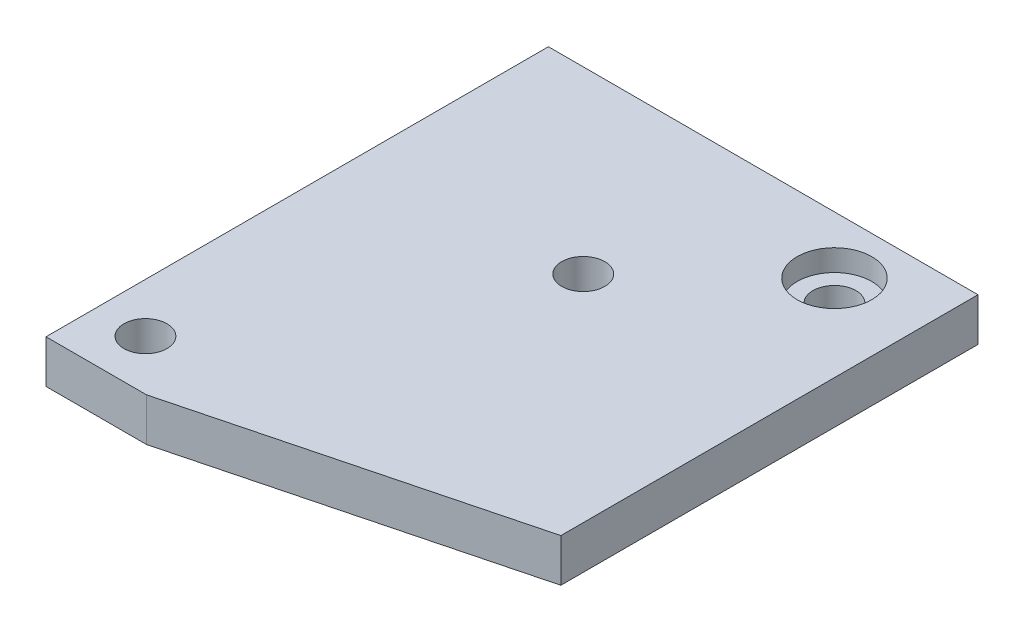
ISO-10303-21;
HEADER;
FILE_DESCRIPTION(('STEP AP214'),'2;1');
FILE_NAME('part.step','',(''),(''),'','','');
FILE_SCHEMA(('AUTOMOTIVE_DESIGN { 1 0 10303 214 1 1 1 1 }'));
ENDSEC;
DATA;
#1=APPLICATION_CONTEXT('core data for automotive mechanical design processes');
#2=APPLICATION_PROTOCOL_DEFINITION('international standard','automotive_design',2000,#1);
#3=PRODUCT_CONTEXT('',#1,'mechanical');
#4=PRODUCT('Part','Part','',(#3));
#5=PRODUCT_RELATED_PRODUCT_CATEGORY('part','',(#4));
#6=PRODUCT_DEFINITION_FORMATION('','',#4);
#7=PRODUCT_DEFINITION_CONTEXT('part definition',#1,'design');
#8=PRODUCT_DEFINITION('design','',#6,#7);
#9=PRODUCT_DEFINITION_SHAPE('','',#8);
#10=(LENGTH_UNIT() NAMED_UNIT(*) SI_UNIT(.MILLI.,.METRE.));
#11=(NAMED_UNIT(*) PLANE_ANGLE_UNIT() SI_UNIT($,.RADIAN.));
#12=(NAMED_UNIT(*) SI_UNIT($,.STERADIAN.) SOLID_ANGLE_UNIT());
#13=UNCERTAINTY_MEASURE_WITH_UNIT(LENGTH_MEASURE(1.E-05),#10,'distance_accuracy_value','');
#14=(GEOMETRIC_REPRESENTATION_CONTEXT(3) GLOBAL_UNCERTAINTY_ASSIGNED_CONTEXT((#13)) GLOBAL_UNIT_ASSIGNED_CONTEXT((#10,
#11,#12)) REPRESENTATION_CONTEXT('',''));
#15=CARTESIAN_POINT('',(0.,0.,0.));
#16=DIRECTION('',(0.,0.,1.));
#17=DIRECTION('',(1.,0.,0.));
#18=AXIS2_PLACEMENT_3D('',#15,#16,#17);
#19=CARTESIAN_POINT('',(-14.9273142149174,-3.,17.5));
#20=DIRECTION('',(0.,1.,0.));
#21=DIRECTION('',(0.,0.,1.));
#22=AXIS2_PLACEMENT_3D('',#19,#20,#21);
#23=PLANE('',#22);
#24=CARTESIAN_POINT('',(0.,-3.,-14.));
#25=DIRECTION('',(0.,-1.,0.));
#26=DIRECTION('',(1.,0.,0.));
#27=AXIS2_PLACEMENT_3D('',#24,#25,#26);
#28=CIRCLE('',#27,0.399766411699347);
#29=CARTESIAN_POINT('',(0.399766411699347,-3.,-14.));
#30=VERTEX_POINT('',#29);
#31=EDGE_CURVE('E206',#30,#30,#28,.T.);
#32=ORIENTED_EDGE('',*,*,#31,.F.);
#33=EDGE_LOOP('',(#32));
#34=FACE_BOUND('',#33,.T.);
#35=CARTESIAN_POINT('',(0.,-3.,-5.));
#36=DIRECTION('',(0.,1.,0.));
#37=DIRECTION('',(0.,0.,1.));
#38=AXIS2_PLACEMENT_3D('',#35,#36,#37);
#39=CIRCLE('',#38,1.5);
#40=CARTESIAN_POINT('',(0.,-3.,-3.5));
#41=VERTEX_POINT('',#40);
#42=EDGE_CURVE('E214',#41,#41,#39,.T.);
#43=ORIENTED_EDGE('',*,*,#42,.T.);
#44=EDGE_LOOP('',(#43));
#45=FACE_BOUND('',#44,.T.);
#46=CARTESIAN_POINT('',(-11.5,-3.,14.));
#47=DIRECTION('',(0.,1.,0.));
#48=DIRECTION('',(0.,0.,1.));
#49=AXIS2_PLACEMENT_3D('',#46,#47,#48);
#50=CIRCLE('',#49,1.5);
#51=CARTESIAN_POINT('',(-11.5,-3.,15.5));
#52=VERTEX_POINT('',#51);
#53=EDGE_CURVE('E185',#52,#52,#50,.T.);
#54=ORIENTED_EDGE('',*,*,#53,.T.);
#55=EDGE_LOOP('',(#54));
#56=FACE_BOUND('',#55,.T.);
#57=CARTESIAN_POINT('',(9.,-3.,-13.5));
#58=DIRECTION('',(0.,1.,0.));
#59=DIRECTION('',(0.,0.,1.));
#60=AXIS2_PLACEMENT_3D('',#57,#58,#59);
#61=CIRCLE('',#60,1.50000000000001);
#62=CARTESIAN_POINT('',(9.,-3.,-12.));
#63=VERTEX_POINT('',#62);
#64=EDGE_CURVE('E127',#63,#63,#61,.T.);
#65=ORIENTED_EDGE('',*,*,#64,.T.);
#66=EDGE_LOOP('',(#65));
#67=FACE_BOUND('',#66,.T.);
#68=DIRECTION('',(0.,0.,1.));
#69=VECTOR('',#68,1.);
#70=CARTESIAN_POINT('',(-14.9273142149174,-3.,-17.5));
#71=LINE('',#70,#69);
#72=CARTESIAN_POINT('',(-14.9273142149174,-3.,-17.5));
#73=VERTEX_POINT('',#72);
#74=CARTESIAN_POINT('',(-14.9273142149174,-3.,17.5));
#75=VERTEX_POINT('',#74);
#76=EDGE_CURVE('E116',#73,#75,#71,.T.);
#77=ORIENTED_EDGE('',*,*,#76,.F.);
#78=DIRECTION('',(-1.,0.,0.));
#79=VECTOR('',#78,1.);
#80=CARTESIAN_POINT('',(-14.9273142149174,-3.,-17.5));
#81=LINE('',#80,#79);
#82=CARTESIAN_POINT('',(15.,-3.,-17.5));
#83=VERTEX_POINT('',#82);
#84=EDGE_CURVE('E106',#83,#73,#81,.T.);
#85=ORIENTED_EDGE('',*,*,#84,.F.);
#86=DIRECTION('',(0.,0.,-1.));
#87=VECTOR('',#86,1.);
#88=CARTESIAN_POINT('',(15.,-3.,-17.5));
#89=LINE('',#88,#87);
#90=CARTESIAN_POINT('',(15.,-3.,11.5602508581691));
#91=VERTEX_POINT('',#90);
#92=EDGE_CURVE('E92',#91,#83,#89,.T.);
#93=ORIENTED_EDGE('',*,*,#92,.F.);
#94=DIRECTION('',(0.968041699521287,0.,-0.250789290018408));
#95=VECTOR('',#94,1.);
#96=CARTESIAN_POINT('',(15.,-3.,11.5602508581691));
#97=LINE('',#96,#95);
#98=CARTESIAN_POINT('',(-7.92731421491738,-3.,17.5));
#99=VERTEX_POINT('',#98);
#100=EDGE_CURVE('E105',#99,#91,#97,.T.);
#101=ORIENTED_EDGE('',*,*,#100,.F.);
#102=DIRECTION('',(1.,0.,0.));
#103=VECTOR('',#102,1.);
#104=CARTESIAN_POINT('',(-14.9273142149174,-3.,17.5));
#105=LINE('',#104,#103);
#106=EDGE_CURVE('E111',#75,#99,#105,.T.);
#107=ORIENTED_EDGE('',*,*,#106,.F.);
#108=EDGE_LOOP('',(#77,#85,#93,#101,#107));
#109=FACE_BOUND('',#108,.T.);
#110=CARTESIAN_POINT('',(0.,-3.,10.));
#111=DIRECTION('',(0.,-1.,0.));
#112=DIRECTION('',(0.,0.,-1.));
#113=AXIS2_PLACEMENT_3D('',#110,#111,#112);
#114=CIRCLE('',#113,0.39659374147233);
#115=CARTESIAN_POINT('',(0.,-3.,9.60340625852767));
#116=VERTEX_POINT('',#115);
#117=EDGE_CURVE('E204',#116,#116,#114,.T.);
#118=ORIENTED_EDGE('',*,*,#117,.F.);
#119=EDGE_LOOP('',(#118));
#120=FACE_BOUND('',#119,.T.);
#121=ADVANCED_FACE('F36',(#34,#45,#56,#67,#109,#120),#23,.F.);
#122=CARTESIAN_POINT('',(-14.9273142149174,-3.,-17.5));
#123=DIRECTION('',(-1.,0.,0.));
#124=DIRECTION('',(0.,0.,1.));
#125=AXIS2_PLACEMENT_3D('',#122,#123,#124);
#126=PLANE('',#125);
#127=DIRECTION('',(0.,0.,1.));
#128=VECTOR('',#127,1.);
#129=CARTESIAN_POINT('',(-14.9273142149174,0.,-17.5));
#130=LINE('',#129,#128);
#131=CARTESIAN_POINT('',(-14.9273142149174,0.,-17.5));
#132=VERTEX_POINT('',#131);
#133=CARTESIAN_POINT('',(-14.9273142149174,0.,17.5));
#134=VERTEX_POINT('',#133);
#135=EDGE_CURVE('E122',#132,#134,#130,.T.);
#136=ORIENTED_EDGE('',*,*,#135,.F.);
#137=DIRECTION('',(0.,1.,0.));
#138=VECTOR('',#137,1.);
#139=CARTESIAN_POINT('',(-14.9273142149174,-3.,-17.5));
#140=LINE('',#139,#138);
#141=EDGE_CURVE('E11',#73,#132,#140,.T.);
#142=ORIENTED_EDGE('',*,*,#141,.F.);
#143=ORIENTED_EDGE('',*,*,#76,.T.);
#144=DIRECTION('',(0.,1.,0.));
#145=VECTOR('',#144,1.);
#146=CARTESIAN_POINT('',(-14.9273142149174,-3.,17.5));
#147=LINE('',#146,#145);
#148=EDGE_CURVE('E40',#75,#134,#147,.T.);
#149=ORIENTED_EDGE('',*,*,#148,.T.);
#150=EDGE_LOOP('',(#136,#142,#143,#149));
#151=FACE_BOUND('',#150,.T.);
#152=ADVANCED_FACE('F38',(#151),#126,.T.);
#153=CARTESIAN_POINT('',(-14.9273142149174,-3.,-17.5));
#154=DIRECTION('',(0.,0.,-1.));
#155=DIRECTION('',(-1.,0.,0.));
#156=AXIS2_PLACEMENT_3D('',#153,#154,#155);
#157=PLANE('',#156);
#158=DIRECTION('',(-1.,0.,0.));
#159=VECTOR('',#158,1.);
#160=CARTESIAN_POINT('',(-14.9273142149174,0.,-17.5));
#161=LINE('',#160,#159);
#162=CARTESIAN_POINT('',(15.,0.,-17.5));
#163=VERTEX_POINT('',#162);
#164=EDGE_CURVE('E135',#163,#132,#161,.T.);
#165=ORIENTED_EDGE('',*,*,#164,.F.);
#166=DIRECTION('',(0.,1.,0.));
#167=VECTOR('',#166,1.);
#168=CARTESIAN_POINT('',(15.,-3.,-17.5));
#169=LINE('',#168,#167);
#170=EDGE_CURVE('E47',#83,#163,#169,.T.);
#171=ORIENTED_EDGE('',*,*,#170,.F.);
#172=ORIENTED_EDGE('',*,*,#84,.T.);
#173=ORIENTED_EDGE('',*,*,#141,.T.);
#174=EDGE_LOOP('',(#165,#171,#172,#173));
#175=FACE_BOUND('',#174,.T.);
#176=ADVANCED_FACE('F144',(#175),#157,.T.);
#177=CARTESIAN_POINT('',(15.,-3.,-17.5));
#178=DIRECTION('',(1.,0.,0.));
#179=DIRECTION('',(0.,0.,-1.));
#180=AXIS2_PLACEMENT_3D('',#177,#178,#179);
#181=PLANE('',#180);
#182=DIRECTION('',(0.,0.,-1.));
#183=VECTOR('',#182,1.);
#184=CARTESIAN_POINT('',(15.,0.,-17.5));
#185=LINE('',#184,#183);
#186=CARTESIAN_POINT('',(15.,0.,11.5602508581691));
#187=VERTEX_POINT('',#186);
#188=EDGE_CURVE('E94',#187,#163,#185,.T.);
#189=ORIENTED_EDGE('',*,*,#188,.F.);
#190=DIRECTION('',(0.,1.,0.));
#191=VECTOR('',#190,1.);
#192=CARTESIAN_POINT('',(15.,-3.,11.5602508581691));
#193=LINE('',#192,#191);
#194=EDGE_CURVE('E89',#91,#187,#193,.T.);
#195=ORIENTED_EDGE('',*,*,#194,.F.);
#196=ORIENTED_EDGE('',*,*,#92,.T.);
#197=ORIENTED_EDGE('',*,*,#170,.T.);
#198=EDGE_LOOP('',(#189,#195,#196,#197));
#199=FACE_BOUND('',#198,.T.);
#200=ADVANCED_FACE('F91',(#199),#181,.T.);
#201=CARTESIAN_POINT('',(15.,-3.,11.5602508581691));
#202=DIRECTION('',(0.250789290018408,0.,0.968041699521287));
#203=DIRECTION('',(0.968041699521288,0.,-0.250789290018409));
#204=AXIS2_PLACEMENT_3D('',#201,#202,#203);
#205=PLANE('',#204);
#206=DIRECTION('',(0.968041699521287,0.,-0.250789290018408));
#207=VECTOR('',#206,1.);
#208=CARTESIAN_POINT('',(15.,0.,11.5602508581691));
#209=LINE('',#208,#207);
#210=CARTESIAN_POINT('',(-7.92731421491738,0.,17.5));
#211=VERTEX_POINT('',#210);
#212=EDGE_CURVE('E131',#211,#187,#209,.T.);
#213=ORIENTED_EDGE('',*,*,#212,.F.);
#214=DIRECTION('',(0.,1.,0.));
#215=VECTOR('',#214,1.);
#216=CARTESIAN_POINT('',(-7.92731421491738,-3.,17.5));
#217=LINE('',#216,#215);
#218=EDGE_CURVE('E100',#99,#211,#217,.T.);
#219=ORIENTED_EDGE('',*,*,#218,.F.);
#220=ORIENTED_EDGE('',*,*,#100,.T.);
#221=ORIENTED_EDGE('',*,*,#194,.T.);
#222=EDGE_LOOP('',(#213,#219,#220,#221));
#223=FACE_BOUND('',#222,.T.);
#224=ADVANCED_FACE('F109',(#223),#205,.T.);
#225=CARTESIAN_POINT('',(-14.9273142149174,-3.,17.5));
#226=DIRECTION('',(0.,0.,1.));
#227=DIRECTION('',(1.,0.,0.));
#228=AXIS2_PLACEMENT_3D('',#225,#226,#227);
#229=PLANE('',#228);
#230=DIRECTION('',(1.,0.,0.));
#231=VECTOR('',#230,1.);
#232=CARTESIAN_POINT('',(-14.9273142149174,0.,17.5));
#233=LINE('',#232,#231);
#234=EDGE_CURVE('E126',#134,#211,#233,.T.);
#235=ORIENTED_EDGE('',*,*,#234,.F.);
#236=ORIENTED_EDGE('',*,*,#148,.F.);
#237=ORIENTED_EDGE('',*,*,#106,.T.);
#238=ORIENTED_EDGE('',*,*,#218,.T.);
#239=EDGE_LOOP('',(#235,#236,#237,#238));
#240=FACE_BOUND('',#239,.T.);
#241=ADVANCED_FACE('F141',(#240),#229,.T.);
#242=CARTESIAN_POINT('',(-14.9273142149174,0.,17.5));
#243=DIRECTION('',(0.,1.,0.));
#244=DIRECTION('',(0.,0.,1.));
#245=AXIS2_PLACEMENT_3D('',#242,#243,#244);
#246=PLANE('',#245);
#247=CARTESIAN_POINT('',(0.,0.,-5.));
#248=DIRECTION('',(0.,1.,0.));
#249=DIRECTION('',(0.,0.,1.));
#250=AXIS2_PLACEMENT_3D('',#247,#248,#249);
#251=CIRCLE('',#250,1.5);
#252=CARTESIAN_POINT('',(0.,0.,-3.5));
#253=VERTEX_POINT('',#252);
#254=EDGE_CURVE('E174',#253,#253,#251,.T.);
#255=ORIENTED_EDGE('',*,*,#254,.F.);
#256=EDGE_LOOP('',(#255));
#257=FACE_BOUND('',#256,.T.);
#258=CARTESIAN_POINT('',(-11.5,0.,14.));
#259=DIRECTION('',(0.,1.,0.));
#260=DIRECTION('',(0.,0.,1.));
#261=AXIS2_PLACEMENT_3D('',#258,#259,#260);
#262=CIRCLE('',#261,1.5);
#263=CARTESIAN_POINT('',(-11.5,0.,15.5));
#264=VERTEX_POINT('',#263);
#265=EDGE_CURVE('E178',#264,#264,#262,.T.);
#266=ORIENTED_EDGE('',*,*,#265,.F.);
#267=EDGE_LOOP('',(#266));
#268=FACE_BOUND('',#267,.T.);
#269=CARTESIAN_POINT('',(9.,0.,-13.5));
#270=DIRECTION('',(0.,1.,0.));
#271=DIRECTION('',(0.,0.,1.));
#272=AXIS2_PLACEMENT_3D('',#269,#270,#271);
#273=CIRCLE('',#272,2.60000000000001);
#274=CARTESIAN_POINT('',(9.,0.,-10.9));
#275=VERTEX_POINT('',#274);
#276=EDGE_CURVE('E181',#275,#275,#273,.T.);
#277=ORIENTED_EDGE('',*,*,#276,.F.);
#278=EDGE_LOOP('',(#277));
#279=FACE_BOUND('',#278,.T.);
#280=ORIENTED_EDGE('',*,*,#135,.T.);
#281=ORIENTED_EDGE('',*,*,#234,.T.);
#282=ORIENTED_EDGE('',*,*,#212,.T.);
#283=ORIENTED_EDGE('',*,*,#188,.T.);
#284=ORIENTED_EDGE('',*,*,#164,.T.);
#285=EDGE_LOOP('',(#280,#281,#282,#283,#284));
#286=FACE_BOUND('',#285,.T.);
#287=ADVANCED_FACE('F143',(#257,#268,#279,#286),#246,.T.);
#288=CARTESIAN_POINT('',(9.,0.,-13.5));
#289=DIRECTION('',(0.,1.,0.));
#290=DIRECTION('',(0.,0.,1.));
#291=AXIS2_PLACEMENT_3D('',#288,#289,#290);
#292=CYLINDRICAL_SURFACE('',#291,1.50000000000001);
#293=ORIENTED_EDGE('',*,*,#64,.F.);
#294=EDGE_LOOP('',(#293));
#295=FACE_BOUND('',#294,.T.);
#296=CARTESIAN_POINT('',(9.,-1.5,-13.5));
#297=DIRECTION('',(0.,1.,0.));
#298=DIRECTION('',(0.,0.,1.));
#299=AXIS2_PLACEMENT_3D('',#296,#297,#298);
#300=CIRCLE('',#299,1.50000000000001);
#301=CARTESIAN_POINT('',(9.,-1.5,-12.));
#302=VERTEX_POINT('',#301);
#303=EDGE_CURVE('E190',#302,#302,#300,.T.);
#304=ORIENTED_EDGE('',*,*,#303,.T.);
#305=EDGE_LOOP('',(#304));
#306=FACE_BOUND('',#305,.T.);
#307=ADVANCED_FACE('F161',(#295,#306),#292,.F.);
#308=CARTESIAN_POINT('',(10.5,-1.5,-13.5));
#309=DIRECTION('',(0.,-1.,0.));
#310=DIRECTION('',(0.,0.,-1.));
#311=AXIS2_PLACEMENT_3D('',#308,#309,#310);
#312=PLANE('',#311);
#313=ORIENTED_EDGE('',*,*,#303,.F.);
#314=EDGE_LOOP('',(#313));
#315=FACE_BOUND('',#314,.T.);
#316=CARTESIAN_POINT('',(9.,-1.5,-13.5));
#317=DIRECTION('',(0.,1.,0.));
#318=DIRECTION('',(0.,0.,1.));
#319=AXIS2_PLACEMENT_3D('',#316,#317,#318);
#320=CIRCLE('',#319,2.60000000000001);
#321=CARTESIAN_POINT('',(9.,-1.5,-10.9));
#322=VERTEX_POINT('',#321);
#323=EDGE_CURVE('E184',#322,#322,#320,.T.);
#324=ORIENTED_EDGE('',*,*,#323,.T.);
#325=EDGE_LOOP('',(#324));
#326=FACE_BOUND('',#325,.T.);
#327=ADVANCED_FACE('F169',(#315,#326),#312,.F.);
#328=CARTESIAN_POINT('',(9.,0.,-13.5));
#329=DIRECTION('',(0.,1.,0.));
#330=DIRECTION('',(0.,0.,1.));
#331=AXIS2_PLACEMENT_3D('',#328,#329,#330);
#332=CYLINDRICAL_SURFACE('',#331,2.60000000000001);
#333=ORIENTED_EDGE('',*,*,#323,.F.);
#334=EDGE_LOOP('',(#333));
#335=FACE_BOUND('',#334,.T.);
#336=ORIENTED_EDGE('',*,*,#276,.T.);
#337=EDGE_LOOP('',(#336));
#338=FACE_BOUND('',#337,.T.);
#339=ADVANCED_FACE('F232',(#335,#338),#332,.F.);
#340=CARTESIAN_POINT('',(-11.5,-3.,14.));
#341=DIRECTION('',(0.,1.,0.));
#342=DIRECTION('',(0.,0.,1.));
#343=AXIS2_PLACEMENT_3D('',#340,#341,#342);
#344=CYLINDRICAL_SURFACE('',#343,1.5);
#345=ORIENTED_EDGE('',*,*,#53,.F.);
#346=EDGE_LOOP('',(#345));
#347=FACE_BOUND('',#346,.T.);
#348=ORIENTED_EDGE('',*,*,#265,.T.);
#349=EDGE_LOOP('',(#348));
#350=FACE_BOUND('',#349,.T.);
#351=ADVANCED_FACE('F222',(#347,#350),#344,.F.);
#352=CARTESIAN_POINT('',(0.,-3.,-5.));
#353=DIRECTION('',(0.,1.,0.));
#354=DIRECTION('',(0.,0.,1.));
#355=AXIS2_PLACEMENT_3D('',#352,#353,#354);
#356=CYLINDRICAL_SURFACE('',#355,1.5);
#357=ORIENTED_EDGE('',*,*,#42,.F.);
#358=EDGE_LOOP('',(#357));
#359=FACE_BOUND('',#358,.T.);
#360=ORIENTED_EDGE('',*,*,#254,.T.);
#361=EDGE_LOOP('',(#360));
#362=FACE_BOUND('',#361,.T.);
#363=ADVANCED_FACE('F219',(#359,#362),#356,.F.);
#364=CARTESIAN_POINT('',(0.,-4.00303389283749,-14.));
#365=DIRECTION('',(0.,-1.,0.));
#366=DIRECTION('',(1.,0.,0.));
#367=AXIS2_PLACEMENT_3D('',#364,#365,#366);
#368=SPHERICAL_SURFACE('',#367,1.07976394369496);
#369=ORIENTED_EDGE('',*,*,#31,.T.);
#370=EDGE_LOOP('',(#369));
#371=FACE_BOUND('',#370,.T.);
#372=ADVANCED_FACE('F221',(#371),#368,.F.);
#373=CARTESIAN_POINT('',(0.,-3.99822280722432,10.));
#374=DIRECTION('',(0.,-1.,0.));
#375=DIRECTION('',(-1.,0.,0.));
#376=AXIS2_PLACEMENT_3D('',#373,#374,#375);
#377=SPHERICAL_SURFACE('',#376,1.07412074211321);
#378=ORIENTED_EDGE('',*,*,#117,.T.);
#379=EDGE_LOOP('',(#378));
#380=FACE_BOUND('',#379,.T.);
#381=ADVANCED_FACE('F229',(#380),#377,.F.);
#382=CLOSED_SHELL('',(#121,#152,#176,#200,#224,#241,#287,#307,#327,#339,#351,#363,#372,#381));
#383=MANIFOLD_SOLID_BREP('B2',#382);
#384=ADVANCED_BREP_SHAPE_REPRESENTATION('',(#18,#383),#14);
#385=SHAPE_DEFINITION_REPRESENTATION(#9,#384);
ENDSEC;
END-ISO-10303-21;
